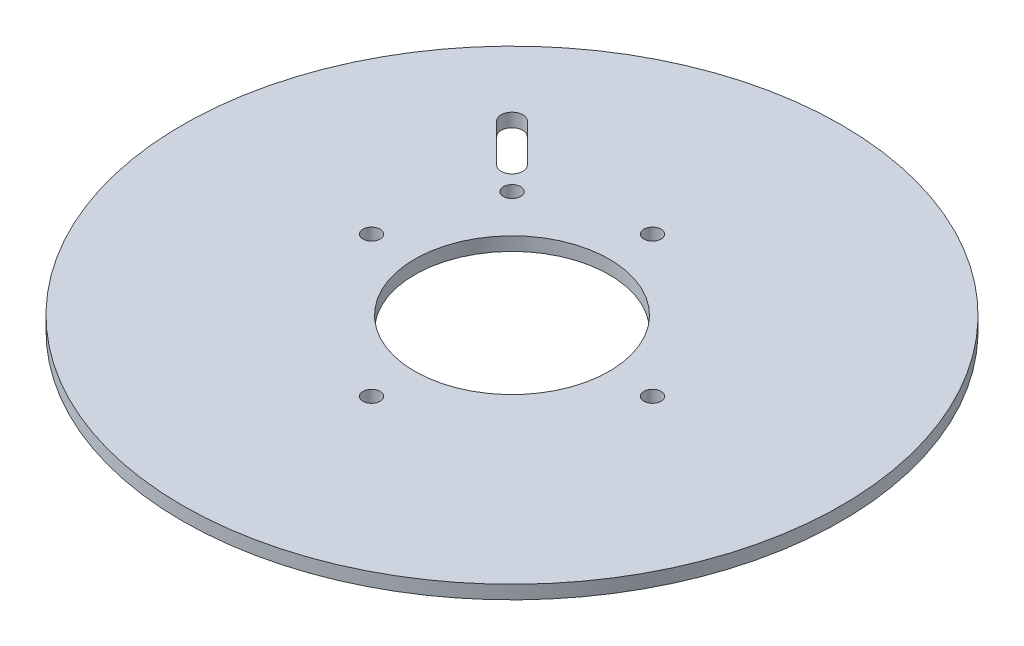
ISO-10303-21;
HEADER;
FILE_DESCRIPTION(('STEP AP214'),'2;1');
FILE_NAME('part.step','',(''),(''),'','','');
FILE_SCHEMA(('AUTOMOTIVE_DESIGN { 1 0 10303 214 1 1 1 1 }'));
ENDSEC;
DATA;
#1=APPLICATION_CONTEXT('core data for automotive mechanical design processes');
#2=APPLICATION_PROTOCOL_DEFINITION('international standard','automotive_design',2000,#1);
#3=PRODUCT_CONTEXT('',#1,'mechanical');
#4=PRODUCT('Part','Part','',(#3));
#5=PRODUCT_RELATED_PRODUCT_CATEGORY('part','',(#4));
#6=PRODUCT_DEFINITION_FORMATION('','',#4);
#7=PRODUCT_DEFINITION_CONTEXT('part definition',#1,'design');
#8=PRODUCT_DEFINITION('design','',#6,#7);
#9=PRODUCT_DEFINITION_SHAPE('','',#8);
#10=(LENGTH_UNIT() NAMED_UNIT(*) SI_UNIT(.MILLI.,.METRE.));
#11=(NAMED_UNIT(*) PLANE_ANGLE_UNIT() SI_UNIT($,.RADIAN.));
#12=(NAMED_UNIT(*) SI_UNIT($,.STERADIAN.) SOLID_ANGLE_UNIT());
#13=UNCERTAINTY_MEASURE_WITH_UNIT(LENGTH_MEASURE(1.E-05),#10,'distance_accuracy_value','');
#14=(GEOMETRIC_REPRESENTATION_CONTEXT(3) GLOBAL_UNCERTAINTY_ASSIGNED_CONTEXT((#13)) GLOBAL_UNIT_ASSIGNED_CONTEXT((#10,
#11,#12)) REPRESENTATION_CONTEXT('',''));
#15=CARTESIAN_POINT('',(0.,0.,0.));
#16=DIRECTION('',(0.,0.,1.));
#17=DIRECTION('',(1.,0.,0.));
#18=AXIS2_PLACEMENT_3D('',#15,#16,#17);
#19=CARTESIAN_POINT('',(0.,3.175,0.));
#20=DIRECTION('',(0.,-1.,0.));
#21=DIRECTION('',(0.,0.,-1.));
#22=AXIS2_PLACEMENT_3D('',#19,#20,#21);
#23=CYLINDRICAL_SURFACE('',#22,77.4600051);
#24=CARTESIAN_POINT('',(0.,3.175,0.));
#25=DIRECTION('',(0.,1.,0.));
#26=DIRECTION('',(0.,0.,1.));
#27=AXIS2_PLACEMENT_3D('',#24,#25,#26);
#28=CIRCLE('',#27,77.4600051);
#29=CARTESIAN_POINT('',(0.,3.175,77.4600051));
#30=VERTEX_POINT('',#29);
#31=EDGE_CURVE('E11',#30,#30,#28,.T.);
#32=ORIENTED_EDGE('',*,*,#31,.F.);
#33=EDGE_LOOP('',(#32));
#34=FACE_BOUND('',#33,.T.);
#35=CARTESIAN_POINT('',(0.,0.,0.));
#36=DIRECTION('',(0.,1.,0.));
#37=DIRECTION('',(0.,0.,1.));
#38=AXIS2_PLACEMENT_3D('',#35,#36,#37);
#39=CIRCLE('',#38,77.4600051);
#40=CARTESIAN_POINT('',(0.,0.,77.4600051));
#41=VERTEX_POINT('',#40);
#42=EDGE_CURVE('E35',#41,#41,#39,.T.);
#43=ORIENTED_EDGE('',*,*,#42,.T.);
#44=EDGE_LOOP('',(#43));
#45=FACE_BOUND('',#44,.T.);
#46=ADVANCED_FACE('F32',(#34,#45),#23,.T.);
#47=CARTESIAN_POINT('',(0.,3.175,0.));
#48=DIRECTION('',(0.,1.,0.));
#49=DIRECTION('',(0.,0.,1.));
#50=AXIS2_PLACEMENT_3D('',#47,#48,#49);
#51=PLANE('',#50);
#52=CARTESIAN_POINT('',(-25.1637927540144,3.175,-25.1637927540141));
#53=DIRECTION('',(0.,1.,0.));
#54=DIRECTION('',(0.,0.,1.));
#55=AXIS2_PLACEMENT_3D('',#52,#53,#54);
#56=CIRCLE('',#55,2.0193);
#57=CARTESIAN_POINT('',(-25.1637927540144,3.175,-23.1444927540141));
#58=VERTEX_POINT('',#57);
#59=EDGE_CURVE('E96',#58,#58,#56,.T.);
#60=ORIENTED_EDGE('',*,*,#59,.F.);
#61=EDGE_LOOP('',(#60));
#62=FACE_BOUND('',#61,.T.);
#63=CARTESIAN_POINT('',(-30.5519464266559,3.175,-30.5519464266555));
#64=DIRECTION('',(0.,1.,0.));
#65=DIRECTION('',(0.,0.,1.));
#66=AXIS2_PLACEMENT_3D('',#63,#64,#65);
#67=CIRCLE('',#66,2.54);
#68=CARTESIAN_POINT('',(-32.3479976508697,3.175,-28.7558952024417));
#69=VERTEX_POINT('',#68);
#70=CARTESIAN_POINT('',(-28.755895202442,3.175,-32.3479976508694));
#71=VERTEX_POINT('',#70);
#72=EDGE_CURVE('E46',#69,#71,#67,.T.);
#73=ORIENTED_EDGE('',*,*,#72,.F.);
#74=DIRECTION('',(0.707106781186548,0.,0.707106781186547));
#75=VECTOR('',#74,1.);
#76=CARTESIAN_POINT('',(-32.3479976508697,3.175,-28.7558952024417));
#77=LINE('',#76,#75);
#78=CARTESIAN_POINT('',(-41.3282537719389,3.175,-37.7361513235109));
#79=VERTEX_POINT('',#78);
#80=EDGE_CURVE('E90',#79,#69,#77,.T.);
#81=ORIENTED_EDGE('',*,*,#80,.F.);
#82=CARTESIAN_POINT('',(-39.532202547725,3.175,-39.5322025477247));
#83=DIRECTION('',(0.,1.,0.));
#84=DIRECTION('',(0.,0.,1.));
#85=AXIS2_PLACEMENT_3D('',#82,#83,#84);
#86=CIRCLE('',#85,2.54000000000001);
#87=CARTESIAN_POINT('',(-37.7361513235112,3.175,-41.3282537719385));
#88=VERTEX_POINT('',#87);
#89=EDGE_CURVE('E93',#88,#79,#86,.T.);
#90=ORIENTED_EDGE('',*,*,#89,.F.);
#91=DIRECTION('',(-0.707106781186548,0.,-0.707106781186547));
#92=VECTOR('',#91,1.);
#93=CARTESIAN_POINT('',(-28.755895202442,3.175,-32.3479976508694));
#94=LINE('',#93,#92);
#95=EDGE_CURVE('E102',#71,#88,#94,.T.);
#96=ORIENTED_EDGE('',*,*,#95,.F.);
#97=EDGE_LOOP('',(#73,#81,#90,#96));
#98=FACE_BOUND('',#97,.T.);
#99=CARTESIAN_POINT('',(-33.0199999999991,3.175,5.68989300120393E-13));
#100=DIRECTION('',(0.,1.,0.));
#101=DIRECTION('',(0.,0.,1.));
#102=AXIS2_PLACEMENT_3D('',#99,#100,#101);
#103=CIRCLE('',#102,2.0193);
#104=CARTESIAN_POINT('',(-33.0199999999991,3.175,2.01930000000057));
#105=VERTEX_POINT('',#104);
#106=EDGE_CURVE('E109',#105,#105,#103,.T.);
#107=ORIENTED_EDGE('',*,*,#106,.F.);
#108=EDGE_LOOP('',(#107));
#109=FACE_BOUND('',#108,.T.);
#110=CARTESIAN_POINT('',(1.63757896132211E-12,3.175,33.02));
#111=DIRECTION('',(0.,1.,0.));
#112=DIRECTION('',(0.,0.,1.));
#113=AXIS2_PLACEMENT_3D('',#110,#111,#112);
#114=CIRCLE('',#113,2.0193);
#115=CARTESIAN_POINT('',(1.63757896132211E-12,3.175,35.0393));
#116=VERTEX_POINT('',#115);
#117=EDGE_CURVE('E116',#116,#116,#114,.T.);
#118=ORIENTED_EDGE('',*,*,#117,.F.);
#119=EDGE_LOOP('',(#118));
#120=FACE_BOUND('',#119,.T.);
#121=CARTESIAN_POINT('',(33.0200000000009,3.175,-8.32667268468867E-13));
#122=DIRECTION('',(0.,1.,0.));
#123=DIRECTION('',(0.,0.,1.));
#124=AXIS2_PLACEMENT_3D('',#121,#122,#123);
#125=CIRCLE('',#124,2.01930000000001);
#126=CARTESIAN_POINT('',(33.0200000000009,3.175,2.01929999999917));
#127=VERTEX_POINT('',#126);
#128=EDGE_CURVE('E122',#127,#127,#125,.T.);
#129=ORIENTED_EDGE('',*,*,#128,.F.);
#130=EDGE_LOOP('',(#129));
#131=FACE_BOUND('',#130,.T.);
#132=CARTESIAN_POINT('',(0.,3.175,-33.02));
#133=DIRECTION('',(0.,1.,0.));
#134=DIRECTION('',(0.,0.,1.));
#135=AXIS2_PLACEMENT_3D('',#132,#133,#134);
#136=CIRCLE('',#135,2.01930000000001);
#137=CARTESIAN_POINT('',(0.,3.175,-31.0007));
#138=VERTEX_POINT('',#137);
#139=EDGE_CURVE('E128',#138,#138,#136,.T.);
#140=ORIENTED_EDGE('',*,*,#139,.F.);
#141=EDGE_LOOP('',(#140));
#142=FACE_BOUND('',#141,.T.);
#143=CARTESIAN_POINT('',(0.,3.175,0.));
#144=DIRECTION('',(0.,1.,0.));
#145=DIRECTION('',(0.,0.,1.));
#146=AXIS2_PLACEMENT_3D('',#143,#144,#145);
#147=CIRCLE('',#146,22.86);
#148=CARTESIAN_POINT('',(0.,3.175,22.86));
#149=VERTEX_POINT('',#148);
#150=EDGE_CURVE('E134',#149,#149,#147,.T.);
#151=ORIENTED_EDGE('',*,*,#150,.F.);
#152=EDGE_LOOP('',(#151));
#153=FACE_BOUND('',#152,.T.);
#154=ORIENTED_EDGE('',*,*,#31,.T.);
#155=EDGE_LOOP('',(#154));
#156=FACE_BOUND('',#155,.T.);
#157=ADVANCED_FACE('F145',(#62,#98,#109,#120,#131,#142,#153,#156),#51,.T.);
#158=CARTESIAN_POINT('',(0.,0.,0.));
#159=DIRECTION('',(0.,1.,0.));
#160=DIRECTION('',(0.,0.,1.));
#161=AXIS2_PLACEMENT_3D('',#158,#159,#160);
#162=PLANE('',#161);
#163=CARTESIAN_POINT('',(-25.1637927540144,0.,-25.1637927540141));
#164=DIRECTION('',(0.,1.,0.));
#165=DIRECTION('',(0.,0.,1.));
#166=AXIS2_PLACEMENT_3D('',#163,#164,#165);
#167=CIRCLE('',#166,2.0193);
#168=CARTESIAN_POINT('',(-25.1637927540144,0.,-23.1444927540141));
#169=VERTEX_POINT('',#168);
#170=EDGE_CURVE('E103',#169,#169,#167,.T.);
#171=ORIENTED_EDGE('',*,*,#170,.T.);
#172=EDGE_LOOP('',(#171));
#173=FACE_BOUND('',#172,.T.);
#174=DIRECTION('',(0.707106781186548,0.,0.707106781186547));
#175=VECTOR('',#174,1.);
#176=CARTESIAN_POINT('',(-32.3479976508697,0.,-28.7558952024417));
#177=LINE('',#176,#175);
#178=CARTESIAN_POINT('',(-41.3282537719389,0.,-37.7361513235109));
#179=VERTEX_POINT('',#178);
#180=CARTESIAN_POINT('',(-32.3479976508697,0.,-28.7558952024417));
#181=VERTEX_POINT('',#180);
#182=EDGE_CURVE('E80',#179,#181,#177,.T.);
#183=ORIENTED_EDGE('',*,*,#182,.T.);
#184=CARTESIAN_POINT('',(-30.5519464266559,0.,-30.5519464266555));
#185=DIRECTION('',(0.,1.,0.));
#186=DIRECTION('',(0.,0.,1.));
#187=AXIS2_PLACEMENT_3D('',#184,#185,#186);
#188=CIRCLE('',#187,2.54);
#189=CARTESIAN_POINT('',(-28.755895202442,0.,-32.3479976508694));
#190=VERTEX_POINT('',#189);
#191=EDGE_CURVE('E74',#181,#190,#188,.T.);
#192=ORIENTED_EDGE('',*,*,#191,.T.);
#193=DIRECTION('',(-0.707106781186548,0.,-0.707106781186547));
#194=VECTOR('',#193,1.);
#195=CARTESIAN_POINT('',(-28.755895202442,0.,-32.3479976508694));
#196=LINE('',#195,#194);
#197=CARTESIAN_POINT('',(-37.7361513235112,0.,-41.3282537719385));
#198=VERTEX_POINT('',#197);
#199=EDGE_CURVE('E83',#190,#198,#196,.T.);
#200=ORIENTED_EDGE('',*,*,#199,.T.);
#201=CARTESIAN_POINT('',(-39.532202547725,0.,-39.5322025477247));
#202=DIRECTION('',(0.,1.,0.));
#203=DIRECTION('',(0.,0.,1.));
#204=AXIS2_PLACEMENT_3D('',#201,#202,#203);
#205=CIRCLE('',#204,2.54000000000001);
#206=EDGE_CURVE('E54',#198,#179,#205,.T.);
#207=ORIENTED_EDGE('',*,*,#206,.T.);
#208=EDGE_LOOP('',(#183,#192,#200,#207));
#209=FACE_BOUND('',#208,.T.);
#210=CARTESIAN_POINT('',(-33.0199999999991,0.,5.68989300120393E-13));
#211=DIRECTION('',(0.,1.,0.));
#212=DIRECTION('',(0.,0.,1.));
#213=AXIS2_PLACEMENT_3D('',#210,#211,#212);
#214=CIRCLE('',#213,2.0193);
#215=CARTESIAN_POINT('',(-33.0199999999991,0.,2.01930000000057));
#216=VERTEX_POINT('',#215);
#217=EDGE_CURVE('E113',#216,#216,#214,.T.);
#218=ORIENTED_EDGE('',*,*,#217,.T.);
#219=EDGE_LOOP('',(#218));
#220=FACE_BOUND('',#219,.T.);
#221=CARTESIAN_POINT('',(1.63757896132211E-12,0.,33.02));
#222=DIRECTION('',(0.,1.,0.));
#223=DIRECTION('',(0.,0.,1.));
#224=AXIS2_PLACEMENT_3D('',#221,#222,#223);
#225=CIRCLE('',#224,2.0193);
#226=CARTESIAN_POINT('',(1.63757896132211E-12,0.,35.0393));
#227=VERTEX_POINT('',#226);
#228=EDGE_CURVE('E119',#227,#227,#225,.T.);
#229=ORIENTED_EDGE('',*,*,#228,.T.);
#230=EDGE_LOOP('',(#229));
#231=FACE_BOUND('',#230,.T.);
#232=CARTESIAN_POINT('',(33.0200000000009,0.,-8.32667268468867E-13));
#233=DIRECTION('',(0.,1.,0.));
#234=DIRECTION('',(0.,0.,1.));
#235=AXIS2_PLACEMENT_3D('',#232,#233,#234);
#236=CIRCLE('',#235,2.01930000000001);
#237=CARTESIAN_POINT('',(33.0200000000009,0.,2.01929999999917));
#238=VERTEX_POINT('',#237);
#239=EDGE_CURVE('E125',#238,#238,#236,.T.);
#240=ORIENTED_EDGE('',*,*,#239,.T.);
#241=EDGE_LOOP('',(#240));
#242=FACE_BOUND('',#241,.T.);
#243=CARTESIAN_POINT('',(0.,0.,-33.02));
#244=DIRECTION('',(0.,1.,0.));
#245=DIRECTION('',(0.,0.,1.));
#246=AXIS2_PLACEMENT_3D('',#243,#244,#245);
#247=CIRCLE('',#246,2.01930000000001);
#248=CARTESIAN_POINT('',(0.,0.,-31.0007));
#249=VERTEX_POINT('',#248);
#250=EDGE_CURVE('E131',#249,#249,#247,.T.);
#251=ORIENTED_EDGE('',*,*,#250,.T.);
#252=EDGE_LOOP('',(#251));
#253=FACE_BOUND('',#252,.T.);
#254=CARTESIAN_POINT('',(0.,0.,0.));
#255=DIRECTION('',(0.,1.,0.));
#256=DIRECTION('',(0.,0.,1.));
#257=AXIS2_PLACEMENT_3D('',#254,#255,#256);
#258=CIRCLE('',#257,22.86);
#259=CARTESIAN_POINT('',(0.,0.,22.86));
#260=VERTEX_POINT('',#259);
#261=EDGE_CURVE('E137',#260,#260,#258,.T.);
#262=ORIENTED_EDGE('',*,*,#261,.T.);
#263=EDGE_LOOP('',(#262));
#264=FACE_BOUND('',#263,.T.);
#265=ORIENTED_EDGE('',*,*,#42,.F.);
#266=EDGE_LOOP('',(#265));
#267=FACE_BOUND('',#266,.T.);
#268=ADVANCED_FACE('F87',(#173,#209,#220,#231,#242,#253,#264,#267),#162,.F.);
#269=CARTESIAN_POINT('',(0.,0.,0.));
#270=DIRECTION('',(0.,1.,0.));
#271=DIRECTION('',(0.,0.,1.));
#272=AXIS2_PLACEMENT_3D('',#269,#270,#271);
#273=CYLINDRICAL_SURFACE('',#272,22.86);
#274=ORIENTED_EDGE('',*,*,#261,.F.);
#275=EDGE_LOOP('',(#274));
#276=FACE_BOUND('',#275,.T.);
#277=ORIENTED_EDGE('',*,*,#150,.T.);
#278=EDGE_LOOP('',(#277));
#279=FACE_BOUND('',#278,.T.);
#280=ADVANCED_FACE('F143',(#276,#279),#273,.F.);
#281=CARTESIAN_POINT('',(0.,0.,-33.02));
#282=DIRECTION('',(0.,1.,0.));
#283=DIRECTION('',(0.,0.,1.));
#284=AXIS2_PLACEMENT_3D('',#281,#282,#283);
#285=CYLINDRICAL_SURFACE('',#284,2.01930000000001);
#286=ORIENTED_EDGE('',*,*,#250,.F.);
#287=EDGE_LOOP('',(#286));
#288=FACE_BOUND('',#287,.T.);
#289=ORIENTED_EDGE('',*,*,#139,.T.);
#290=EDGE_LOOP('',(#289));
#291=FACE_BOUND('',#290,.T.);
#292=ADVANCED_FACE('F162',(#288,#291),#285,.F.);
#293=CARTESIAN_POINT('',(33.0200000000009,0.,-8.32667268468867E-13));
#294=DIRECTION('',(0.,1.,0.));
#295=DIRECTION('',(0.,0.,1.));
#296=AXIS2_PLACEMENT_3D('',#293,#294,#295);
#297=CYLINDRICAL_SURFACE('',#296,2.01930000000001);
#298=ORIENTED_EDGE('',*,*,#239,.F.);
#299=EDGE_LOOP('',(#298));
#300=FACE_BOUND('',#299,.T.);
#301=ORIENTED_EDGE('',*,*,#128,.T.);
#302=EDGE_LOOP('',(#301));
#303=FACE_BOUND('',#302,.T.);
#304=ADVANCED_FACE('F169',(#300,#303),#297,.F.);
#305=CARTESIAN_POINT('',(1.63757896132211E-12,0.,33.02));
#306=DIRECTION('',(0.,1.,0.));
#307=DIRECTION('',(0.,0.,1.));
#308=AXIS2_PLACEMENT_3D('',#305,#306,#307);
#309=CYLINDRICAL_SURFACE('',#308,2.0193);
#310=ORIENTED_EDGE('',*,*,#228,.F.);
#311=EDGE_LOOP('',(#310));
#312=FACE_BOUND('',#311,.T.);
#313=ORIENTED_EDGE('',*,*,#117,.T.);
#314=EDGE_LOOP('',(#313));
#315=FACE_BOUND('',#314,.T.);
#316=ADVANCED_FACE('F173',(#312,#315),#309,.F.);
#317=CARTESIAN_POINT('',(-33.0199999999991,0.,5.68989300120393E-13));
#318=DIRECTION('',(0.,1.,0.));
#319=DIRECTION('',(0.,0.,1.));
#320=AXIS2_PLACEMENT_3D('',#317,#318,#319);
#321=CYLINDRICAL_SURFACE('',#320,2.0193);
#322=ORIENTED_EDGE('',*,*,#217,.F.);
#323=EDGE_LOOP('',(#322));
#324=FACE_BOUND('',#323,.T.);
#325=ORIENTED_EDGE('',*,*,#106,.T.);
#326=EDGE_LOOP('',(#325));
#327=FACE_BOUND('',#326,.T.);
#328=ADVANCED_FACE('F177',(#324,#327),#321,.F.);
#329=CARTESIAN_POINT('',(-30.5519464266559,0.,-30.5519464266555));
#330=DIRECTION('',(0.,1.,0.));
#331=DIRECTION('',(0.,0.,1.));
#332=AXIS2_PLACEMENT_3D('',#329,#330,#331);
#333=CYLINDRICAL_SURFACE('',#332,2.54);
#334=ORIENTED_EDGE('',*,*,#72,.T.);
#335=DIRECTION('',(0.,1.,0.));
#336=VECTOR('',#335,1.);
#337=CARTESIAN_POINT('',(-28.755895202442,0.,-32.3479976508694));
#338=LINE('',#337,#336);
#339=EDGE_CURVE('E70',#190,#71,#338,.T.);
#340=ORIENTED_EDGE('',*,*,#339,.F.);
#341=ORIENTED_EDGE('',*,*,#191,.F.);
#342=DIRECTION('',(0.,1.,0.));
#343=VECTOR('',#342,1.);
#344=CARTESIAN_POINT('',(-32.3479976508697,0.,-28.7558952024417));
#345=LINE('',#344,#343);
#346=EDGE_CURVE('E107',#181,#69,#345,.T.);
#347=ORIENTED_EDGE('',*,*,#346,.T.);
#348=EDGE_LOOP('',(#334,#340,#341,#347));
#349=FACE_BOUND('',#348,.T.);
#350=ADVANCED_FACE('F72',(#349),#333,.F.);
#351=CARTESIAN_POINT('',(-32.3479976508697,0.,-28.7558952024417));
#352=DIRECTION('',(-0.707106781186547,0.,0.707106781186548));
#353=DIRECTION('',(0.707106781186548,0.,0.707106781186547));
#354=AXIS2_PLACEMENT_3D('',#351,#352,#353);
#355=PLANE('',#354);
#356=ORIENTED_EDGE('',*,*,#80,.T.);
#357=ORIENTED_EDGE('',*,*,#346,.F.);
#358=ORIENTED_EDGE('',*,*,#182,.F.);
#359=DIRECTION('',(0.,1.,0.));
#360=VECTOR('',#359,1.);
#361=CARTESIAN_POINT('',(-41.3282537719389,0.,-37.7361513235109));
#362=LINE('',#361,#360);
#363=EDGE_CURVE('E110',#179,#79,#362,.T.);
#364=ORIENTED_EDGE('',*,*,#363,.T.);
#365=EDGE_LOOP('',(#356,#357,#358,#364));
#366=FACE_BOUND('',#365,.T.);
#367=ADVANCED_FACE('F184',(#366),#355,.F.);
#368=CARTESIAN_POINT('',(-39.532202547725,0.,-39.5322025477247));
#369=DIRECTION('',(0.,1.,0.));
#370=DIRECTION('',(0.,0.,1.));
#371=AXIS2_PLACEMENT_3D('',#368,#369,#370);
#372=CYLINDRICAL_SURFACE('',#371,2.54000000000001);
#373=ORIENTED_EDGE('',*,*,#89,.T.);
#374=ORIENTED_EDGE('',*,*,#363,.F.);
#375=ORIENTED_EDGE('',*,*,#206,.F.);
#376=DIRECTION('',(0.,1.,0.));
#377=VECTOR('',#376,1.);
#378=CARTESIAN_POINT('',(-37.7361513235112,0.,-41.3282537719385));
#379=LINE('',#378,#377);
#380=EDGE_CURVE('E79',#198,#88,#379,.T.);
#381=ORIENTED_EDGE('',*,*,#380,.T.);
#382=EDGE_LOOP('',(#373,#374,#375,#381));
#383=FACE_BOUND('',#382,.T.);
#384=ADVANCED_FACE('F188',(#383),#372,.F.);
#385=CARTESIAN_POINT('',(-28.755895202442,0.,-32.3479976508694));
#386=DIRECTION('',(0.707106781186547,0.,-0.707106781186548));
#387=DIRECTION('',(-0.707106781186548,0.,-0.707106781186547));
#388=AXIS2_PLACEMENT_3D('',#385,#386,#387);
#389=PLANE('',#388);
#390=ORIENTED_EDGE('',*,*,#95,.T.);
#391=ORIENTED_EDGE('',*,*,#380,.F.);
#392=ORIENTED_EDGE('',*,*,#199,.F.);
#393=ORIENTED_EDGE('',*,*,#339,.T.);
#394=EDGE_LOOP('',(#390,#391,#392,#393));
#395=FACE_BOUND('',#394,.T.);
#396=ADVANCED_FACE('F84',(#395),#389,.F.);
#397=CARTESIAN_POINT('',(-25.1637927540144,0.,-25.1637927540141));
#398=DIRECTION('',(0.,1.,0.));
#399=DIRECTION('',(0.,0.,1.));
#400=AXIS2_PLACEMENT_3D('',#397,#398,#399);
#401=CYLINDRICAL_SURFACE('',#400,2.0193);
#402=ORIENTED_EDGE('',*,*,#170,.F.);
#403=EDGE_LOOP('',(#402));
#404=FACE_BOUND('',#403,.T.);
#405=ORIENTED_EDGE('',*,*,#59,.T.);
#406=EDGE_LOOP('',(#405));
#407=FACE_BOUND('',#406,.T.);
#408=ADVANCED_FACE('F187',(#404,#407),#401,.F.);
#409=CLOSED_SHELL('',(#46,#157,#268,#280,#292,#304,#316,#328,#350,#367,#384,#396,#408));
#410=MANIFOLD_SOLID_BREP('B2',#409);
#411=ADVANCED_BREP_SHAPE_REPRESENTATION('',(#18,#410),#14);
#412=SHAPE_DEFINITION_REPRESENTATION(#9,#411);
ENDSEC;
END-ISO-10303-21;
